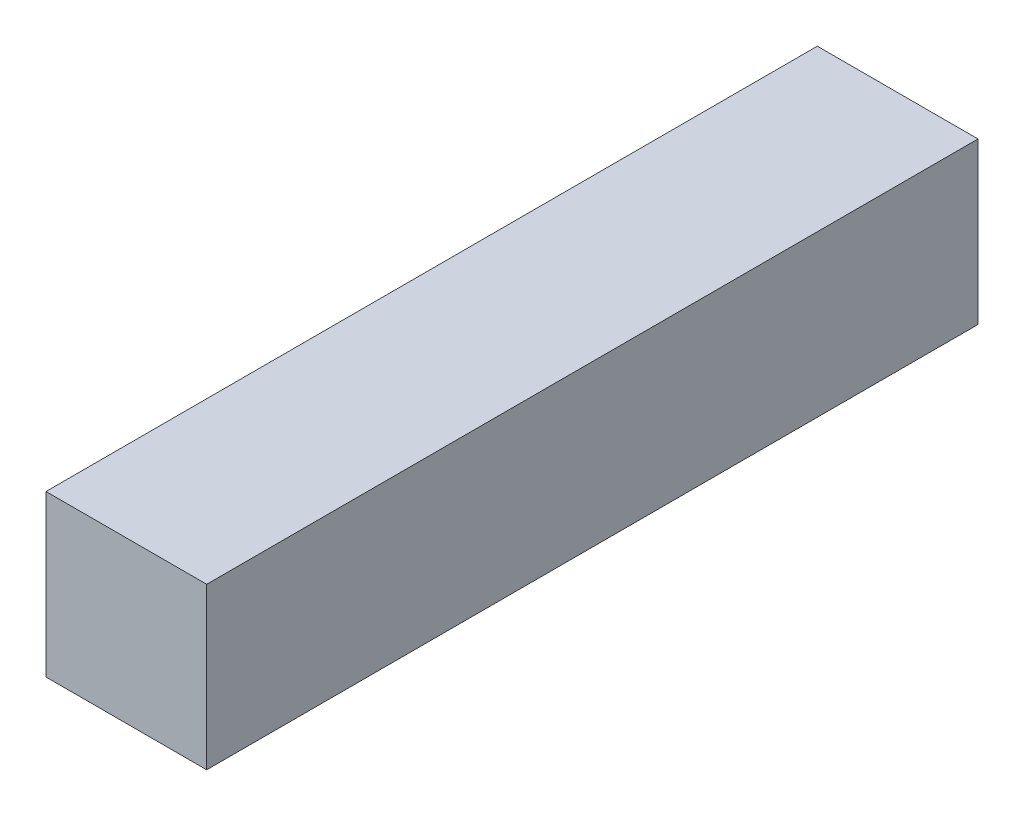
ISO-10303-21;
HEADER;
FILE_DESCRIPTION(('STEP AP214'),'2;1');
FILE_NAME('part.step','',(''),(''),'','','');
FILE_SCHEMA(('AUTOMOTIVE_DESIGN { 1 0 10303 214 1 1 1 1 }'));
ENDSEC;
DATA;
#1=APPLICATION_CONTEXT('core data for automotive mechanical design processes');
#2=APPLICATION_PROTOCOL_DEFINITION('international standard','automotive_design',2000,#1);
#3=PRODUCT_CONTEXT('',#1,'mechanical');
#4=PRODUCT('Part','Part','',(#3));
#5=PRODUCT_RELATED_PRODUCT_CATEGORY('part','',(#4));
#6=PRODUCT_DEFINITION_FORMATION('','',#4);
#7=PRODUCT_DEFINITION_CONTEXT('part definition',#1,'design');
#8=PRODUCT_DEFINITION('design','',#6,#7);
#9=PRODUCT_DEFINITION_SHAPE('','',#8);
#10=(LENGTH_UNIT() NAMED_UNIT(*) SI_UNIT(.MILLI.,.METRE.));
#11=(NAMED_UNIT(*) PLANE_ANGLE_UNIT() SI_UNIT($,.RADIAN.));
#12=(NAMED_UNIT(*) SI_UNIT($,.STERADIAN.) SOLID_ANGLE_UNIT());
#13=UNCERTAINTY_MEASURE_WITH_UNIT(LENGTH_MEASURE(1.E-05),#10,'distance_accuracy_value','');
#14=(GEOMETRIC_REPRESENTATION_CONTEXT(3) GLOBAL_UNCERTAINTY_ASSIGNED_CONTEXT((#13)) GLOBAL_UNIT_ASSIGNED_CONTEXT((#10,
#11,#12)) REPRESENTATION_CONTEXT('',''));
#15=CARTESIAN_POINT('',(0.,0.,0.));
#16=DIRECTION('',(0.,0.,1.));
#17=DIRECTION('',(1.,0.,0.));
#18=AXIS2_PLACEMENT_3D('',#15,#16,#17);
#19=CARTESIAN_POINT('',(-7.5,-7.5,72.));
#20=DIRECTION('',(0.,-1.,0.));
#21=DIRECTION('',(0.,0.,-1.));
#22=AXIS2_PLACEMENT_3D('',#19,#20,#21);
#23=PLANE('',#22);
#24=DIRECTION('',(0.,0.,-1.));
#25=VECTOR('',#24,1.);
#26=CARTESIAN_POINT('',(7.5,-7.5,72.));
#27=LINE('',#26,#25);
#28=CARTESIAN_POINT('',(7.5,-7.5,72.));
#29=VERTEX_POINT('',#28);
#30=CARTESIAN_POINT('',(7.5,-7.5,0.));
#31=VERTEX_POINT('',#30);
#32=EDGE_CURVE('E113',#29,#31,#27,.T.);
#33=ORIENTED_EDGE('',*,*,#32,.F.);
#34=DIRECTION('',(1.,0.,0.));
#35=VECTOR('',#34,1.);
#36=CARTESIAN_POINT('',(-7.5,-7.5,72.));
#37=LINE('',#36,#35);
#38=CARTESIAN_POINT('',(-7.5,-7.5,72.));
#39=VERTEX_POINT('',#38);
#40=EDGE_CURVE('E11',#39,#29,#37,.T.);
#41=ORIENTED_EDGE('',*,*,#40,.F.);
#42=DIRECTION('',(0.,0.,-1.));
#43=VECTOR('',#42,1.);
#44=CARTESIAN_POINT('',(-7.5,-7.5,72.));
#45=LINE('',#44,#43);
#46=CARTESIAN_POINT('',(-7.5,-7.5,0.));
#47=VERTEX_POINT('',#46);
#48=EDGE_CURVE('E105',#39,#47,#45,.T.);
#49=ORIENTED_EDGE('',*,*,#48,.T.);
#50=DIRECTION('',(1.,0.,0.));
#51=VECTOR('',#50,1.);
#52=CARTESIAN_POINT('',(-7.5,-7.5,0.));
#53=LINE('',#52,#51);
#54=EDGE_CURVE('E46',#47,#31,#53,.T.);
#55=ORIENTED_EDGE('',*,*,#54,.T.);
#56=EDGE_LOOP('',(#33,#41,#49,#55));
#57=FACE_BOUND('',#56,.T.);
#58=ADVANCED_FACE('F43',(#57),#23,.T.);
#59=CARTESIAN_POINT('',(-7.5,7.5,72.));
#60=DIRECTION('',(0.,0.,1.));
#61=DIRECTION('',(1.,0.,0.));
#62=AXIS2_PLACEMENT_3D('',#59,#60,#61);
#63=PLANE('',#62);
#64=DIRECTION('',(0.,-1.,0.));
#65=VECTOR('',#64,1.);
#66=CARTESIAN_POINT('',(7.5,7.5,72.));
#67=LINE('',#66,#65);
#68=CARTESIAN_POINT('',(7.5,7.5,72.));
#69=VERTEX_POINT('',#68);
#70=EDGE_CURVE('E108',#69,#29,#67,.T.);
#71=ORIENTED_EDGE('',*,*,#70,.F.);
#72=DIRECTION('',(1.,0.,0.));
#73=VECTOR('',#72,1.);
#74=CARTESIAN_POINT('',(-7.5,7.5,72.));
#75=LINE('',#74,#73);
#76=CARTESIAN_POINT('',(-7.5,7.5,72.));
#77=VERTEX_POINT('',#76);
#78=EDGE_CURVE('E53',#77,#69,#75,.T.);
#79=ORIENTED_EDGE('',*,*,#78,.F.);
#80=DIRECTION('',(0.,-1.,0.));
#81=VECTOR('',#80,1.);
#82=CARTESIAN_POINT('',(-7.5,7.5,72.));
#83=LINE('',#82,#81);
#84=EDGE_CURVE('E100',#77,#39,#83,.T.);
#85=ORIENTED_EDGE('',*,*,#84,.T.);
#86=ORIENTED_EDGE('',*,*,#40,.T.);
#87=EDGE_LOOP('',(#71,#79,#85,#86));
#88=FACE_BOUND('',#87,.T.);
#89=ADVANCED_FACE('F129',(#88),#63,.T.);
#90=CARTESIAN_POINT('',(-7.5,7.5,0.));
#91=DIRECTION('',(0.,1.,0.));
#92=DIRECTION('',(0.,0.,1.));
#93=AXIS2_PLACEMENT_3D('',#90,#91,#92);
#94=PLANE('',#93);
#95=DIRECTION('',(0.,0.,1.));
#96=VECTOR('',#95,1.);
#97=CARTESIAN_POINT('',(7.5,7.5,0.));
#98=LINE('',#97,#96);
#99=CARTESIAN_POINT('',(7.5,7.5,0.));
#100=VERTEX_POINT('',#99);
#101=EDGE_CURVE('E94',#100,#69,#98,.T.);
#102=ORIENTED_EDGE('',*,*,#101,.F.);
#103=DIRECTION('',(1.,0.,0.));
#104=VECTOR('',#103,1.);
#105=CARTESIAN_POINT('',(-7.5,7.5,0.));
#106=LINE('',#105,#104);
#107=CARTESIAN_POINT('',(-7.5,7.5,0.));
#108=VERTEX_POINT('',#107);
#109=EDGE_CURVE('E89',#108,#100,#106,.T.);
#110=ORIENTED_EDGE('',*,*,#109,.F.);
#111=DIRECTION('',(0.,0.,1.));
#112=VECTOR('',#111,1.);
#113=CARTESIAN_POINT('',(-7.5,7.5,0.));
#114=LINE('',#113,#112);
#115=EDGE_CURVE('E92',#108,#77,#114,.T.);
#116=ORIENTED_EDGE('',*,*,#115,.T.);
#117=ORIENTED_EDGE('',*,*,#78,.T.);
#118=EDGE_LOOP('',(#102,#110,#116,#117));
#119=FACE_BOUND('',#118,.T.);
#120=ADVANCED_FACE('F91',(#119),#94,.T.);
#121=CARTESIAN_POINT('',(-7.5,-7.5,0.));
#122=DIRECTION('',(0.,0.,-1.));
#123=DIRECTION('',(-1.,0.,0.));
#124=AXIS2_PLACEMENT_3D('',#121,#122,#123);
#125=PLANE('',#124);
#126=DIRECTION('',(0.,1.,0.));
#127=VECTOR('',#126,1.);
#128=CARTESIAN_POINT('',(7.5,-7.5,0.));
#129=LINE('',#128,#127);
#130=EDGE_CURVE('E117',#31,#100,#129,.T.);
#131=ORIENTED_EDGE('',*,*,#130,.F.);
#132=ORIENTED_EDGE('',*,*,#54,.F.);
#133=DIRECTION('',(0.,1.,0.));
#134=VECTOR('',#133,1.);
#135=CARTESIAN_POINT('',(-7.5,-7.5,0.));
#136=LINE('',#135,#134);
#137=EDGE_CURVE('E99',#47,#108,#136,.T.);
#138=ORIENTED_EDGE('',*,*,#137,.T.);
#139=ORIENTED_EDGE('',*,*,#109,.T.);
#140=EDGE_LOOP('',(#131,#132,#138,#139));
#141=FACE_BOUND('',#140,.T.);
#142=ADVANCED_FACE('F103',(#141),#125,.T.);
#143=CARTESIAN_POINT('',(-7.5,0.,0.));
#144=DIRECTION('',(1.,0.,0.));
#145=DIRECTION('',(0.,0.,-1.));
#146=AXIS2_PLACEMENT_3D('',#143,#144,#145);
#147=PLANE('',#146);
#148=ORIENTED_EDGE('',*,*,#48,.F.);
#149=ORIENTED_EDGE('',*,*,#84,.F.);
#150=ORIENTED_EDGE('',*,*,#115,.F.);
#151=ORIENTED_EDGE('',*,*,#137,.F.);
#152=EDGE_LOOP('',(#148,#149,#150,#151));
#153=FACE_BOUND('',#152,.T.);
#154=ADVANCED_FACE('F98',(#153),#147,.F.);
#155=CARTESIAN_POINT('',(7.5,0.,0.));
#156=DIRECTION('',(1.,0.,0.));
#157=DIRECTION('',(0.,0.,-1.));
#158=AXIS2_PLACEMENT_3D('',#155,#156,#157);
#159=PLANE('',#158);
#160=ORIENTED_EDGE('',*,*,#32,.T.);
#161=ORIENTED_EDGE('',*,*,#130,.T.);
#162=ORIENTED_EDGE('',*,*,#101,.T.);
#163=ORIENTED_EDGE('',*,*,#70,.T.);
#164=EDGE_LOOP('',(#160,#161,#162,#163));
#165=FACE_BOUND('',#164,.T.);
#166=ADVANCED_FACE('F128',(#165),#159,.T.);
#167=CLOSED_SHELL('',(#58,#89,#120,#142,#154,#166));
#168=MANIFOLD_SOLID_BREP('B2',#167);
#169=ADVANCED_BREP_SHAPE_REPRESENTATION('',(#18,#168),#14);
#170=SHAPE_DEFINITION_REPRESENTATION(#9,#169);
ENDSEC;
END-ISO-10303-21;
